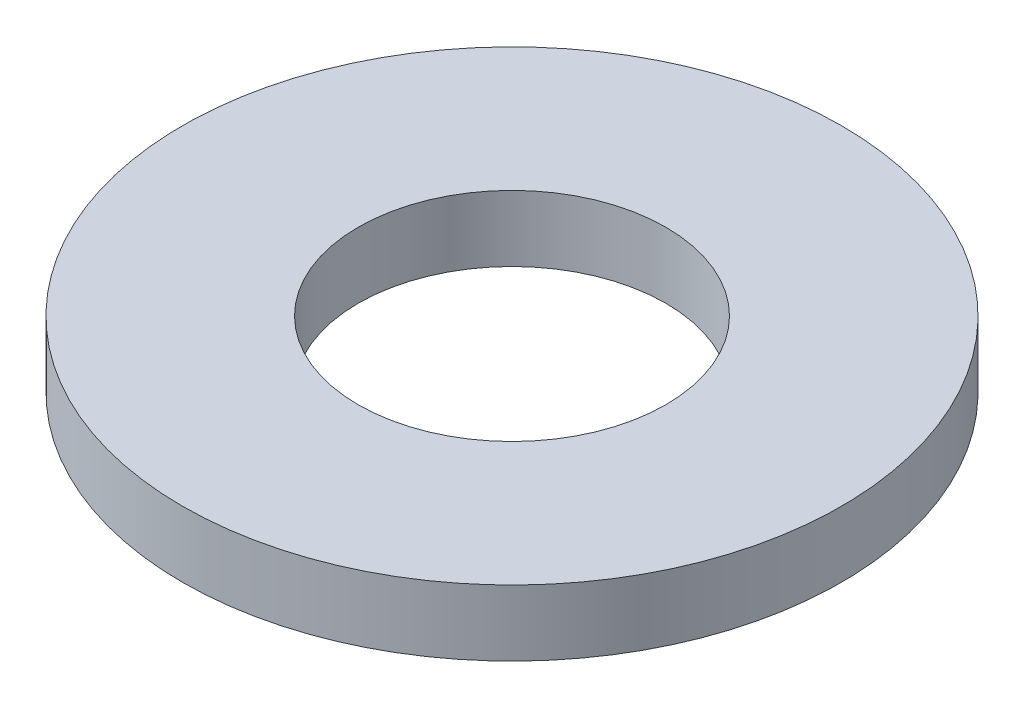
ISO-10303-21;
HEADER;
FILE_DESCRIPTION(('STEP AP214'),'2;1');
FILE_NAME('part.step','',(''),(''),'','','');
FILE_SCHEMA(('AUTOMOTIVE_DESIGN { 1 0 10303 214 1 1 1 1 }'));
ENDSEC;
DATA;
#1=APPLICATION_CONTEXT('core data for automotive mechanical design processes');
#2=APPLICATION_PROTOCOL_DEFINITION('international standard','automotive_design',2000,#1);
#3=PRODUCT_CONTEXT('',#1,'mechanical');
#4=PRODUCT('Part','Part','',(#3));
#5=PRODUCT_RELATED_PRODUCT_CATEGORY('part','',(#4));
#6=PRODUCT_DEFINITION_FORMATION('','',#4);
#7=PRODUCT_DEFINITION_CONTEXT('part definition',#1,'design');
#8=PRODUCT_DEFINITION('design','',#6,#7);
#9=PRODUCT_DEFINITION_SHAPE('','',#8);
#10=(LENGTH_UNIT() NAMED_UNIT(*) SI_UNIT(.MILLI.,.METRE.));
#11=(NAMED_UNIT(*) PLANE_ANGLE_UNIT() SI_UNIT($,.RADIAN.));
#12=(NAMED_UNIT(*) SI_UNIT($,.STERADIAN.) SOLID_ANGLE_UNIT());
#13=UNCERTAINTY_MEASURE_WITH_UNIT(LENGTH_MEASURE(1.E-05),#10,'distance_accuracy_value','');
#14=(GEOMETRIC_REPRESENTATION_CONTEXT(3) GLOBAL_UNCERTAINTY_ASSIGNED_CONTEXT((#13)) GLOBAL_UNIT_ASSIGNED_CONTEXT((#10,
#11,#12)) REPRESENTATION_CONTEXT('',''));
#15=CARTESIAN_POINT('',(0.,0.,0.));
#16=DIRECTION('',(0.,0.,1.));
#17=DIRECTION('',(1.,0.,0.));
#18=AXIS2_PLACEMENT_3D('',#15,#16,#17);
#19=CARTESIAN_POINT('',(0.,0.75,0.));
#20=DIRECTION('',(0.,1.,0.));
#21=DIRECTION('',(0.,0.,1.));
#22=AXIS2_PLACEMENT_3D('',#19,#20,#21);
#23=PLANE('',#22);
#24=CARTESIAN_POINT('',(0.,0.75,0.));
#25=DIRECTION('',(0.,1.,0.));
#26=DIRECTION('',(0.,0.,1.));
#27=AXIS2_PLACEMENT_3D('',#24,#25,#26);
#28=CIRCLE('',#27,3.75);
#29=CARTESIAN_POINT('',(0.,0.75,3.75));
#30=VERTEX_POINT('',#29);
#31=EDGE_CURVE('E10',#30,#30,#28,.T.);
#32=ORIENTED_EDGE('',*,*,#31,.T.);
#33=EDGE_LOOP('',(#32));
#34=FACE_BOUND('',#33,.T.);
#35=CARTESIAN_POINT('',(0.,0.75,0.));
#36=DIRECTION('',(0.,1.,0.));
#37=DIRECTION('',(0.,0.,1.));
#38=AXIS2_PLACEMENT_3D('',#35,#36,#37);
#39=CIRCLE('',#38,1.75);
#40=CARTESIAN_POINT('',(0.,0.75,1.75));
#41=VERTEX_POINT('',#40);
#42=EDGE_CURVE('E42',#41,#41,#39,.T.);
#43=ORIENTED_EDGE('',*,*,#42,.F.);
#44=EDGE_LOOP('',(#43));
#45=FACE_BOUND('',#44,.T.);
#46=ADVANCED_FACE('F31',(#34,#45),#23,.T.);
#47=CARTESIAN_POINT('',(0.,0.,0.));
#48=DIRECTION('',(0.,1.,0.));
#49=DIRECTION('',(0.,0.,1.));
#50=AXIS2_PLACEMENT_3D('',#47,#48,#49);
#51=PLANE('',#50);
#52=CARTESIAN_POINT('',(0.,0.,0.));
#53=DIRECTION('',(0.,1.,0.));
#54=DIRECTION('',(0.,0.,1.));
#55=AXIS2_PLACEMENT_3D('',#52,#53,#54);
#56=CIRCLE('',#55,3.75);
#57=CARTESIAN_POINT('',(0.,0.,3.75));
#58=VERTEX_POINT('',#57);
#59=EDGE_CURVE('E35',#58,#58,#56,.T.);
#60=ORIENTED_EDGE('',*,*,#59,.F.);
#61=EDGE_LOOP('',(#60));
#62=FACE_BOUND('',#61,.T.);
#63=CARTESIAN_POINT('',(0.,0.,0.));
#64=DIRECTION('',(0.,1.,0.));
#65=DIRECTION('',(0.,0.,1.));
#66=AXIS2_PLACEMENT_3D('',#63,#64,#65);
#67=CIRCLE('',#66,1.75);
#68=CARTESIAN_POINT('',(0.,0.,1.75));
#69=VERTEX_POINT('',#68);
#70=EDGE_CURVE('E44',#69,#69,#67,.T.);
#71=ORIENTED_EDGE('',*,*,#70,.T.);
#72=EDGE_LOOP('',(#71));
#73=FACE_BOUND('',#72,.T.);
#74=ADVANCED_FACE('F54',(#62,#73),#51,.F.);
#75=CARTESIAN_POINT('',(0.,0.75,0.));
#76=DIRECTION('',(0.,-1.,0.));
#77=DIRECTION('',(0.,0.,-1.));
#78=AXIS2_PLACEMENT_3D('',#75,#76,#77);
#79=CYLINDRICAL_SURFACE('',#78,3.75);
#80=ORIENTED_EDGE('',*,*,#31,.F.);
#81=EDGE_LOOP('',(#80));
#82=FACE_BOUND('',#81,.T.);
#83=ORIENTED_EDGE('',*,*,#59,.T.);
#84=EDGE_LOOP('',(#83));
#85=FACE_BOUND('',#84,.T.);
#86=ADVANCED_FACE('F33',(#82,#85),#79,.T.);
#87=CARTESIAN_POINT('',(0.,0.75,0.));
#88=DIRECTION('',(0.,-1.,0.));
#89=DIRECTION('',(0.,0.,-1.));
#90=AXIS2_PLACEMENT_3D('',#87,#88,#89);
#91=CYLINDRICAL_SURFACE('',#90,1.75);
#92=ORIENTED_EDGE('',*,*,#42,.T.);
#93=EDGE_LOOP('',(#92));
#94=FACE_BOUND('',#93,.T.);
#95=ORIENTED_EDGE('',*,*,#70,.F.);
#96=EDGE_LOOP('',(#95));
#97=FACE_BOUND('',#96,.T.);
#98=ADVANCED_FACE('F50',(#94,#97),#91,.F.);
#99=CLOSED_SHELL('',(#46,#74,#86,#98));
#100=MANIFOLD_SOLID_BREP('B2',#99);
#101=ADVANCED_BREP_SHAPE_REPRESENTATION('',(#18,#100),#14);
#102=SHAPE_DEFINITION_REPRESENTATION(#9,#101);
ENDSEC;
END-ISO-10303-21;
